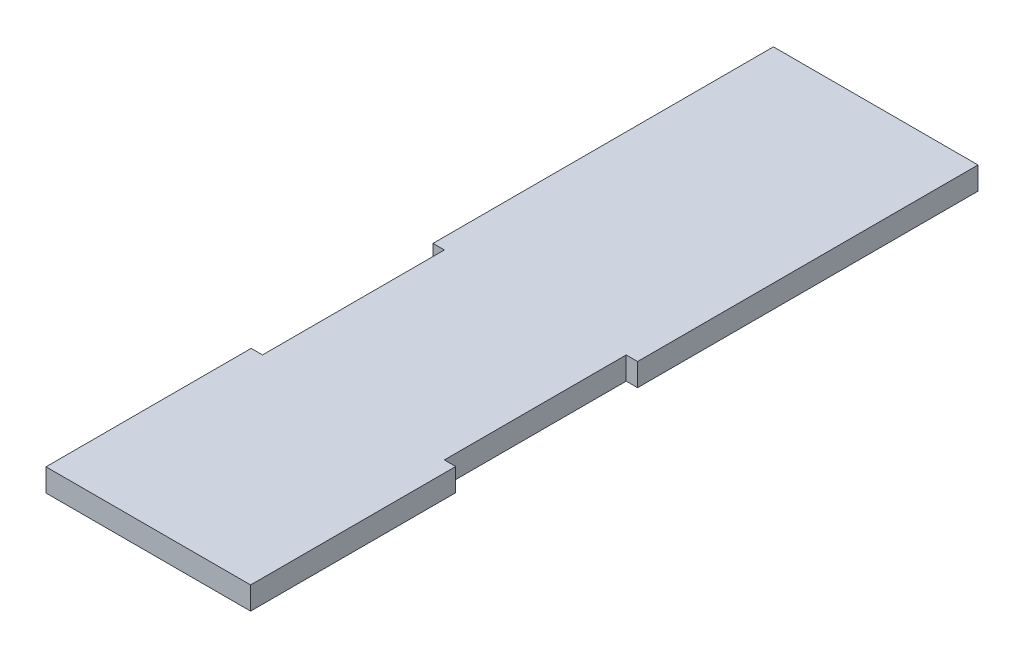
ISO-10303-21;
HEADER;
FILE_DESCRIPTION(('STEP AP214'),'2;1');
FILE_NAME('part.step','',(''),(''),'','','');
FILE_SCHEMA(('AUTOMOTIVE_DESIGN { 1 0 10303 214 1 1 1 1 }'));
ENDSEC;
DATA;
#1=APPLICATION_CONTEXT('core data for automotive mechanical design processes');
#2=APPLICATION_PROTOCOL_DEFINITION('international standard','automotive_design',2000,#1);
#3=PRODUCT_CONTEXT('',#1,'mechanical');
#4=PRODUCT('Part','Part','',(#3));
#5=PRODUCT_RELATED_PRODUCT_CATEGORY('part','',(#4));
#6=PRODUCT_DEFINITION_FORMATION('','',#4);
#7=PRODUCT_DEFINITION_CONTEXT('part definition',#1,'design');
#8=PRODUCT_DEFINITION('design','',#6,#7);
#9=PRODUCT_DEFINITION_SHAPE('','',#8);
#10=(LENGTH_UNIT() NAMED_UNIT(*) SI_UNIT(.MILLI.,.METRE.));
#11=(NAMED_UNIT(*) PLANE_ANGLE_UNIT() SI_UNIT($,.RADIAN.));
#12=(NAMED_UNIT(*) SI_UNIT($,.STERADIAN.) SOLID_ANGLE_UNIT());
#13=UNCERTAINTY_MEASURE_WITH_UNIT(LENGTH_MEASURE(1.E-05),#10,'distance_accuracy_value','');
#14=(GEOMETRIC_REPRESENTATION_CONTEXT(3) GLOBAL_UNCERTAINTY_ASSIGNED_CONTEXT((#13)) GLOBAL_UNIT_ASSIGNED_CONTEXT((#10,
#11,#12)) REPRESENTATION_CONTEXT('',''));
#15=CARTESIAN_POINT('',(0.,0.,0.));
#16=DIRECTION('',(0.,0.,1.));
#17=DIRECTION('',(1.,0.,0.));
#18=AXIS2_PLACEMENT_3D('',#15,#16,#17);
#19=CARTESIAN_POINT('',(0.,1.5875,-1.6256));
#20=DIRECTION('',(0.,0.,1.));
#21=DIRECTION('',(1.,0.,0.));
#22=AXIS2_PLACEMENT_3D('',#19,#20,#21);
#23=PLANE('',#22);
#24=DIRECTION('',(-1.,0.,0.));
#25=VECTOR('',#24,1.);
#26=CARTESIAN_POINT('',(0.,0.,-1.6256));
#27=LINE('',#26,#25);
#28=CARTESIAN_POINT('',(7.14375,0.,-1.6256));
#29=VERTEX_POINT('',#28);
#30=CARTESIAN_POINT('',(6.35,0.,-1.6256));
#31=VERTEX_POINT('',#30);
#32=EDGE_CURVE('E166',#29,#31,#27,.T.);
#33=ORIENTED_EDGE('',*,*,#32,.F.);
#34=DIRECTION('',(0.,-1.,0.));
#35=VECTOR('',#34,1.);
#36=CARTESIAN_POINT('',(7.14375,1.5875,-1.6256));
#37=LINE('',#36,#35);
#38=CARTESIAN_POINT('',(7.14375,1.5875,-1.6256));
#39=VERTEX_POINT('',#38);
#40=EDGE_CURVE('E11',#39,#29,#37,.T.);
#41=ORIENTED_EDGE('',*,*,#40,.F.);
#42=DIRECTION('',(-1.,0.,0.));
#43=VECTOR('',#42,1.);
#44=CARTESIAN_POINT('',(0.,1.5875,-1.6256));
#45=LINE('',#44,#43);
#46=CARTESIAN_POINT('',(6.35,1.5875,-1.6256));
#47=VERTEX_POINT('',#46);
#48=EDGE_CURVE('E203',#39,#47,#45,.T.);
#49=ORIENTED_EDGE('',*,*,#48,.T.);
#50=DIRECTION('',(0.,-1.,0.));
#51=VECTOR('',#50,1.);
#52=CARTESIAN_POINT('',(6.35,1.5875,-1.6256));
#53=LINE('',#52,#51);
#54=EDGE_CURVE('E105',#47,#31,#53,.T.);
#55=ORIENTED_EDGE('',*,*,#54,.T.);
#56=EDGE_LOOP('',(#33,#41,#49,#55));
#57=FACE_BOUND('',#56,.T.);
#58=ADVANCED_FACE('F41',(#57),#23,.T.);
#59=CARTESIAN_POINT('',(7.14375,1.5875,0.));
#60=DIRECTION('',(-1.,0.,0.));
#61=DIRECTION('',(0.,0.,1.));
#62=AXIS2_PLACEMENT_3D('',#59,#60,#61);
#63=PLANE('',#62);
#64=DIRECTION('',(0.,0.,-1.));
#65=VECTOR('',#64,1.);
#66=CARTESIAN_POINT('',(7.14375,0.,0.));
#67=LINE('',#66,#65);
#68=CARTESIAN_POINT('',(7.14375,0.,-25.4));
#69=VERTEX_POINT('',#68);
#70=EDGE_CURVE('E170',#29,#69,#67,.T.);
#71=ORIENTED_EDGE('',*,*,#70,.T.);
#72=DIRECTION('',(0.,-1.,0.));
#73=VECTOR('',#72,1.);
#74=CARTESIAN_POINT('',(7.14375,1.5875,-25.4));
#75=LINE('',#74,#73);
#76=CARTESIAN_POINT('',(7.14375,1.5875,-25.4));
#77=VERTEX_POINT('',#76);
#78=EDGE_CURVE('E50',#77,#69,#75,.T.);
#79=ORIENTED_EDGE('',*,*,#78,.F.);
#80=DIRECTION('',(0.,0.,-1.));
#81=VECTOR('',#80,1.);
#82=CARTESIAN_POINT('',(7.14375,1.5875,0.));
#83=LINE('',#82,#81);
#84=EDGE_CURVE('E149',#39,#77,#83,.T.);
#85=ORIENTED_EDGE('',*,*,#84,.F.);
#86=ORIENTED_EDGE('',*,*,#40,.T.);
#87=EDGE_LOOP('',(#71,#79,#85,#86));
#88=FACE_BOUND('',#87,.T.);
#89=ADVANCED_FACE('F237',(#88),#63,.F.);
#90=CARTESIAN_POINT('',(0.,1.5875,-25.4));
#91=DIRECTION('',(0.,0.,-1.));
#92=DIRECTION('',(-1.,0.,0.));
#93=AXIS2_PLACEMENT_3D('',#90,#91,#92);
#94=PLANE('',#93);
#95=DIRECTION('',(1.,0.,0.));
#96=VECTOR('',#95,1.);
#97=CARTESIAN_POINT('',(0.,0.,-25.4));
#98=LINE('',#97,#96);
#99=CARTESIAN_POINT('',(-7.14375,0.,-25.4));
#100=VERTEX_POINT('',#99);
#101=EDGE_CURVE('E174',#100,#69,#98,.T.);
#102=ORIENTED_EDGE('',*,*,#101,.F.);
#103=DIRECTION('',(0.,-1.,0.));
#104=VECTOR('',#103,1.);
#105=CARTESIAN_POINT('',(-7.14375,1.5875,-25.4));
#106=LINE('',#105,#104);
#107=CARTESIAN_POINT('',(-7.14375,1.5875,-25.4));
#108=VERTEX_POINT('',#107);
#109=EDGE_CURVE('E225',#108,#100,#106,.T.);
#110=ORIENTED_EDGE('',*,*,#109,.F.);
#111=DIRECTION('',(1.,0.,0.));
#112=VECTOR('',#111,1.);
#113=CARTESIAN_POINT('',(0.,1.5875,-25.4));
#114=LINE('',#113,#112);
#115=EDGE_CURVE('E234',#108,#77,#114,.T.);
#116=ORIENTED_EDGE('',*,*,#115,.T.);
#117=ORIENTED_EDGE('',*,*,#78,.T.);
#118=EDGE_LOOP('',(#102,#110,#116,#117));
#119=FACE_BOUND('',#118,.T.);
#120=ADVANCED_FACE('F232',(#119),#94,.T.);
#121=CARTESIAN_POINT('',(-7.14375,1.5875,0.));
#122=DIRECTION('',(-1.,0.,0.));
#123=DIRECTION('',(0.,0.,1.));
#124=AXIS2_PLACEMENT_3D('',#121,#122,#123);
#125=PLANE('',#124);
#126=DIRECTION('',(0.,0.,-1.));
#127=VECTOR('',#126,1.);
#128=CARTESIAN_POINT('',(-7.14375,0.,0.));
#129=LINE('',#128,#127);
#130=CARTESIAN_POINT('',(-7.14375,0.,-1.6256));
#131=VERTEX_POINT('',#130);
#132=EDGE_CURVE('E178',#131,#100,#129,.T.);
#133=ORIENTED_EDGE('',*,*,#132,.F.);
#134=DIRECTION('',(0.,-1.,0.));
#135=VECTOR('',#134,1.);
#136=CARTESIAN_POINT('',(-7.14375,1.5875,-1.6256));
#137=LINE('',#136,#135);
#138=CARTESIAN_POINT('',(-7.14375,1.5875,-1.6256));
#139=VERTEX_POINT('',#138);
#140=EDGE_CURVE('E222',#139,#131,#137,.T.);
#141=ORIENTED_EDGE('',*,*,#140,.F.);
#142=DIRECTION('',(0.,0.,-1.));
#143=VECTOR('',#142,1.);
#144=CARTESIAN_POINT('',(-7.14375,1.5875,0.));
#145=LINE('',#144,#143);
#146=EDGE_CURVE('E247',#139,#108,#145,.T.);
#147=ORIENTED_EDGE('',*,*,#146,.T.);
#148=ORIENTED_EDGE('',*,*,#109,.T.);
#149=EDGE_LOOP('',(#133,#141,#147,#148));
#150=FACE_BOUND('',#149,.T.);
#151=ADVANCED_FACE('F243',(#150),#125,.T.);
#152=CARTESIAN_POINT('',(0.,1.5875,-1.6256));
#153=DIRECTION('',(0.,0.,-1.));
#154=DIRECTION('',(-1.,0.,0.));
#155=AXIS2_PLACEMENT_3D('',#152,#153,#154);
#156=PLANE('',#155);
#157=DIRECTION('',(1.,0.,0.));
#158=VECTOR('',#157,1.);
#159=CARTESIAN_POINT('',(0.,0.,-1.6256));
#160=LINE('',#159,#158);
#161=CARTESIAN_POINT('',(-6.35,0.,-1.6256));
#162=VERTEX_POINT('',#161);
#163=EDGE_CURVE('E182',#131,#162,#160,.T.);
#164=ORIENTED_EDGE('',*,*,#163,.T.);
#165=DIRECTION('',(0.,-1.,0.));
#166=VECTOR('',#165,1.);
#167=CARTESIAN_POINT('',(-6.35,1.5875,-1.6256));
#168=LINE('',#167,#166);
#169=CARTESIAN_POINT('',(-6.35,1.5875,-1.6256));
#170=VERTEX_POINT('',#169);
#171=EDGE_CURVE('E219',#170,#162,#168,.T.);
#172=ORIENTED_EDGE('',*,*,#171,.F.);
#173=DIRECTION('',(1.,0.,0.));
#174=VECTOR('',#173,1.);
#175=CARTESIAN_POINT('',(0.,1.5875,-1.6256));
#176=LINE('',#175,#174);
#177=EDGE_CURVE('E252',#139,#170,#176,.T.);
#178=ORIENTED_EDGE('',*,*,#177,.F.);
#179=ORIENTED_EDGE('',*,*,#140,.T.);
#180=EDGE_LOOP('',(#164,#172,#178,#179));
#181=FACE_BOUND('',#180,.T.);
#182=ADVANCED_FACE('F312',(#181),#156,.F.);
#183=CARTESIAN_POINT('',(-6.35,1.5875,0.));
#184=DIRECTION('',(-1.,0.,0.));
#185=DIRECTION('',(0.,0.,1.));
#186=AXIS2_PLACEMENT_3D('',#183,#184,#185);
#187=PLANE('',#186);
#188=DIRECTION('',(0.,0.,-1.));
#189=VECTOR('',#188,1.);
#190=CARTESIAN_POINT('',(-6.35,0.,0.));
#191=LINE('',#190,#189);
#192=CARTESIAN_POINT('',(-6.35,0.,11.0744));
#193=VERTEX_POINT('',#192);
#194=EDGE_CURVE('E187',#193,#162,#191,.T.);
#195=ORIENTED_EDGE('',*,*,#194,.F.);
#196=DIRECTION('',(0.,-1.,0.));
#197=VECTOR('',#196,1.);
#198=CARTESIAN_POINT('',(-6.35,1.5875,11.0744));
#199=LINE('',#198,#197);
#200=CARTESIAN_POINT('',(-6.35,1.5875,11.0744));
#201=VERTEX_POINT('',#200);
#202=EDGE_CURVE('E216',#201,#193,#199,.T.);
#203=ORIENTED_EDGE('',*,*,#202,.F.);
#204=DIRECTION('',(0.,0.,-1.));
#205=VECTOR('',#204,1.);
#206=CARTESIAN_POINT('',(-6.35,1.5875,0.));
#207=LINE('',#206,#205);
#208=EDGE_CURVE('E259',#201,#170,#207,.T.);
#209=ORIENTED_EDGE('',*,*,#208,.T.);
#210=ORIENTED_EDGE('',*,*,#171,.T.);
#211=EDGE_LOOP('',(#195,#203,#209,#210));
#212=FACE_BOUND('',#211,.T.);
#213=ADVANCED_FACE('F278',(#212),#187,.T.);
#214=CARTESIAN_POINT('',(0.,1.5875,11.0744));
#215=DIRECTION('',(0.,0.,-1.));
#216=DIRECTION('',(-1.,0.,0.));
#217=AXIS2_PLACEMENT_3D('',#214,#215,#216);
#218=PLANE('',#217);
#219=DIRECTION('',(1.,0.,0.));
#220=VECTOR('',#219,1.);
#221=CARTESIAN_POINT('',(0.,0.,11.0744));
#222=LINE('',#221,#220);
#223=CARTESIAN_POINT('',(-7.14375,0.,11.0744));
#224=VERTEX_POINT('',#223);
#225=EDGE_CURVE('E191',#224,#193,#222,.T.);
#226=ORIENTED_EDGE('',*,*,#225,.F.);
#227=DIRECTION('',(0.,-1.,0.));
#228=VECTOR('',#227,1.);
#229=CARTESIAN_POINT('',(-7.14375,1.5875,11.0744));
#230=LINE('',#229,#228);
#231=CARTESIAN_POINT('',(-7.14375,1.5875,11.0744));
#232=VERTEX_POINT('',#231);
#233=EDGE_CURVE('E213',#232,#224,#230,.T.);
#234=ORIENTED_EDGE('',*,*,#233,.F.);
#235=DIRECTION('',(1.,0.,0.));
#236=VECTOR('',#235,1.);
#237=CARTESIAN_POINT('',(0.,1.5875,11.0744));
#238=LINE('',#237,#236);
#239=EDGE_CURVE('E262',#232,#201,#238,.T.);
#240=ORIENTED_EDGE('',*,*,#239,.T.);
#241=ORIENTED_EDGE('',*,*,#202,.T.);
#242=EDGE_LOOP('',(#226,#234,#240,#241));
#243=FACE_BOUND('',#242,.T.);
#244=ADVANCED_FACE('F279',(#243),#218,.T.);
#245=CARTESIAN_POINT('',(-7.14375,0.,25.4));
#246=VERTEX_POINT('',#245);
#247=EDGE_CURVE('E183',#246,#224,#129,.T.);
#248=ORIENTED_EDGE('',*,*,#247,.F.);
#249=DIRECTION('',(0.,-1.,0.));
#250=VECTOR('',#249,1.);
#251=CARTESIAN_POINT('',(-7.14375,1.5875,25.4));
#252=LINE('',#251,#250);
#253=CARTESIAN_POINT('',(-7.14375,1.5875,25.4));
#254=VERTEX_POINT('',#253);
#255=EDGE_CURVE('E210',#254,#246,#252,.T.);
#256=ORIENTED_EDGE('',*,*,#255,.F.);
#257=EDGE_CURVE('E254',#254,#232,#145,.T.);
#258=ORIENTED_EDGE('',*,*,#257,.T.);
#259=ORIENTED_EDGE('',*,*,#233,.T.);
#260=EDGE_LOOP('',(#248,#256,#258,#259));
#261=FACE_BOUND('',#260,.T.);
#262=ADVANCED_FACE('F272',(#261),#125,.T.);
#263=CARTESIAN_POINT('',(0.,1.5875,25.4));
#264=DIRECTION('',(0.,0.,-1.));
#265=DIRECTION('',(-1.,0.,0.));
#266=AXIS2_PLACEMENT_3D('',#263,#264,#265);
#267=PLANE('',#266);
#268=DIRECTION('',(1.,0.,0.));
#269=VECTOR('',#268,1.);
#270=CARTESIAN_POINT('',(0.,0.,25.4));
#271=LINE('',#270,#269);
#272=CARTESIAN_POINT('',(7.14375,0.,25.4));
#273=VERTEX_POINT('',#272);
#274=EDGE_CURVE('E195',#246,#273,#271,.T.);
#275=ORIENTED_EDGE('',*,*,#274,.T.);
#276=DIRECTION('',(0.,-1.,0.));
#277=VECTOR('',#276,1.);
#278=CARTESIAN_POINT('',(7.14375,1.5875,25.4));
#279=LINE('',#278,#277);
#280=CARTESIAN_POINT('',(7.14375,1.5875,25.4));
#281=VERTEX_POINT('',#280);
#282=EDGE_CURVE('E155',#281,#273,#279,.T.);
#283=ORIENTED_EDGE('',*,*,#282,.F.);
#284=DIRECTION('',(1.,0.,0.));
#285=VECTOR('',#284,1.);
#286=CARTESIAN_POINT('',(0.,1.5875,25.4));
#287=LINE('',#286,#285);
#288=EDGE_CURVE('E143',#254,#281,#287,.T.);
#289=ORIENTED_EDGE('',*,*,#288,.F.);
#290=ORIENTED_EDGE('',*,*,#255,.T.);
#291=EDGE_LOOP('',(#275,#283,#289,#290));
#292=FACE_BOUND('',#291,.T.);
#293=ADVANCED_FACE('F296',(#292),#267,.F.);
#294=CARTESIAN_POINT('',(7.14375,0.,11.0744));
#295=VERTEX_POINT('',#294);
#296=EDGE_CURVE('E153',#273,#295,#67,.T.);
#297=ORIENTED_EDGE('',*,*,#296,.T.);
#298=DIRECTION('',(0.,-1.,0.));
#299=VECTOR('',#298,1.);
#300=CARTESIAN_POINT('',(7.14375,1.5875,11.0744));
#301=LINE('',#300,#299);
#302=CARTESIAN_POINT('',(7.14375,1.5875,11.0744));
#303=VERTEX_POINT('',#302);
#304=EDGE_CURVE('E150',#303,#295,#301,.T.);
#305=ORIENTED_EDGE('',*,*,#304,.F.);
#306=EDGE_CURVE('E136',#281,#303,#83,.T.);
#307=ORIENTED_EDGE('',*,*,#306,.F.);
#308=ORIENTED_EDGE('',*,*,#282,.T.);
#309=EDGE_LOOP('',(#297,#305,#307,#308));
#310=FACE_BOUND('',#309,.T.);
#311=ADVANCED_FACE('F151',(#310),#63,.F.);
#312=CARTESIAN_POINT('',(0.,1.5875,11.0744));
#313=DIRECTION('',(0.,0.,1.));
#314=DIRECTION('',(1.,0.,0.));
#315=AXIS2_PLACEMENT_3D('',#312,#313,#314);
#316=PLANE('',#315);
#317=DIRECTION('',(-1.,0.,0.));
#318=VECTOR('',#317,1.);
#319=CARTESIAN_POINT('',(0.,0.,11.0744));
#320=LINE('',#319,#318);
#321=CARTESIAN_POINT('',(6.35,0.,11.0744));
#322=VERTEX_POINT('',#321);
#323=EDGE_CURVE('E98',#295,#322,#320,.T.);
#324=ORIENTED_EDGE('',*,*,#323,.T.);
#325=DIRECTION('',(0.,-1.,0.));
#326=VECTOR('',#325,1.);
#327=CARTESIAN_POINT('',(6.35,1.5875,11.0744));
#328=LINE('',#327,#326);
#329=CARTESIAN_POINT('',(6.35,1.5875,11.0744));
#330=VERTEX_POINT('',#329);
#331=EDGE_CURVE('E156',#330,#322,#328,.T.);
#332=ORIENTED_EDGE('',*,*,#331,.F.);
#333=DIRECTION('',(-1.,0.,0.));
#334=VECTOR('',#333,1.);
#335=CARTESIAN_POINT('',(0.,1.5875,11.0744));
#336=LINE('',#335,#334);
#337=EDGE_CURVE('E140',#303,#330,#336,.T.);
#338=ORIENTED_EDGE('',*,*,#337,.F.);
#339=ORIENTED_EDGE('',*,*,#304,.T.);
#340=EDGE_LOOP('',(#324,#332,#338,#339));
#341=FACE_BOUND('',#340,.T.);
#342=ADVANCED_FACE('F158',(#341),#316,.F.);
#343=CARTESIAN_POINT('',(6.35,1.5875,0.));
#344=DIRECTION('',(-1.,0.,0.));
#345=DIRECTION('',(0.,0.,1.));
#346=AXIS2_PLACEMENT_3D('',#343,#344,#345);
#347=PLANE('',#346);
#348=DIRECTION('',(0.,0.,-1.));
#349=VECTOR('',#348,1.);
#350=CARTESIAN_POINT('',(6.35,0.,0.));
#351=LINE('',#350,#349);
#352=EDGE_CURVE('E200',#322,#31,#351,.T.);
#353=ORIENTED_EDGE('',*,*,#352,.T.);
#354=ORIENTED_EDGE('',*,*,#54,.F.);
#355=DIRECTION('',(0.,0.,-1.));
#356=VECTOR('',#355,1.);
#357=CARTESIAN_POINT('',(6.35,1.5875,0.));
#358=LINE('',#357,#356);
#359=EDGE_CURVE('E58',#330,#47,#358,.T.);
#360=ORIENTED_EDGE('',*,*,#359,.F.);
#361=ORIENTED_EDGE('',*,*,#331,.T.);
#362=EDGE_LOOP('',(#353,#354,#360,#361));
#363=FACE_BOUND('',#362,.T.);
#364=ADVANCED_FACE('F301',(#363),#347,.F.);
#365=CARTESIAN_POINT('',(0.,1.5875,0.));
#366=DIRECTION('',(0.,1.,0.));
#367=DIRECTION('',(0.,0.,1.));
#368=AXIS2_PLACEMENT_3D('',#365,#366,#367);
#369=PLANE('',#368);
#370=ORIENTED_EDGE('',*,*,#48,.F.);
#371=ORIENTED_EDGE('',*,*,#84,.T.);
#372=ORIENTED_EDGE('',*,*,#115,.F.);
#373=ORIENTED_EDGE('',*,*,#146,.F.);
#374=ORIENTED_EDGE('',*,*,#177,.T.);
#375=ORIENTED_EDGE('',*,*,#208,.F.);
#376=ORIENTED_EDGE('',*,*,#239,.F.);
#377=ORIENTED_EDGE('',*,*,#257,.F.);
#378=ORIENTED_EDGE('',*,*,#288,.T.);
#379=ORIENTED_EDGE('',*,*,#306,.T.);
#380=ORIENTED_EDGE('',*,*,#337,.T.);
#381=ORIENTED_EDGE('',*,*,#359,.T.);
#382=EDGE_LOOP('',(#370,#371,#372,#373,#374,#375,#376,#377,#378,#379,#380,#381));
#383=FACE_BOUND('',#382,.T.);
#384=ADVANCED_FACE('F138',(#383),#369,.T.);
#385=CARTESIAN_POINT('',(0.,0.,0.));
#386=DIRECTION('',(0.,1.,0.));
#387=DIRECTION('',(0.,0.,1.));
#388=AXIS2_PLACEMENT_3D('',#385,#386,#387);
#389=PLANE('',#388);
#390=ORIENTED_EDGE('',*,*,#32,.T.);
#391=ORIENTED_EDGE('',*,*,#352,.F.);
#392=ORIENTED_EDGE('',*,*,#323,.F.);
#393=ORIENTED_EDGE('',*,*,#296,.F.);
#394=ORIENTED_EDGE('',*,*,#274,.F.);
#395=ORIENTED_EDGE('',*,*,#247,.T.);
#396=ORIENTED_EDGE('',*,*,#225,.T.);
#397=ORIENTED_EDGE('',*,*,#194,.T.);
#398=ORIENTED_EDGE('',*,*,#163,.F.);
#399=ORIENTED_EDGE('',*,*,#132,.T.);
#400=ORIENTED_EDGE('',*,*,#101,.T.);
#401=ORIENTED_EDGE('',*,*,#70,.F.);
#402=EDGE_LOOP('',(#390,#391,#392,#393,#394,#395,#396,#397,#398,#399,#400,#401));
#403=FACE_BOUND('',#402,.T.);
#404=ADVANCED_FACE('F239',(#403),#389,.F.);
#405=CLOSED_SHELL('',(#58,#89,#120,#151,#182,#213,#244,#262,#293,#311,#342,#364,#384,#404));
#406=MANIFOLD_SOLID_BREP('B2',#405);
#407=ADVANCED_BREP_SHAPE_REPRESENTATION('',(#18,#406),#14);
#408=SHAPE_DEFINITION_REPRESENTATION(#9,#407);
ENDSEC;
END-ISO-10303-21;
